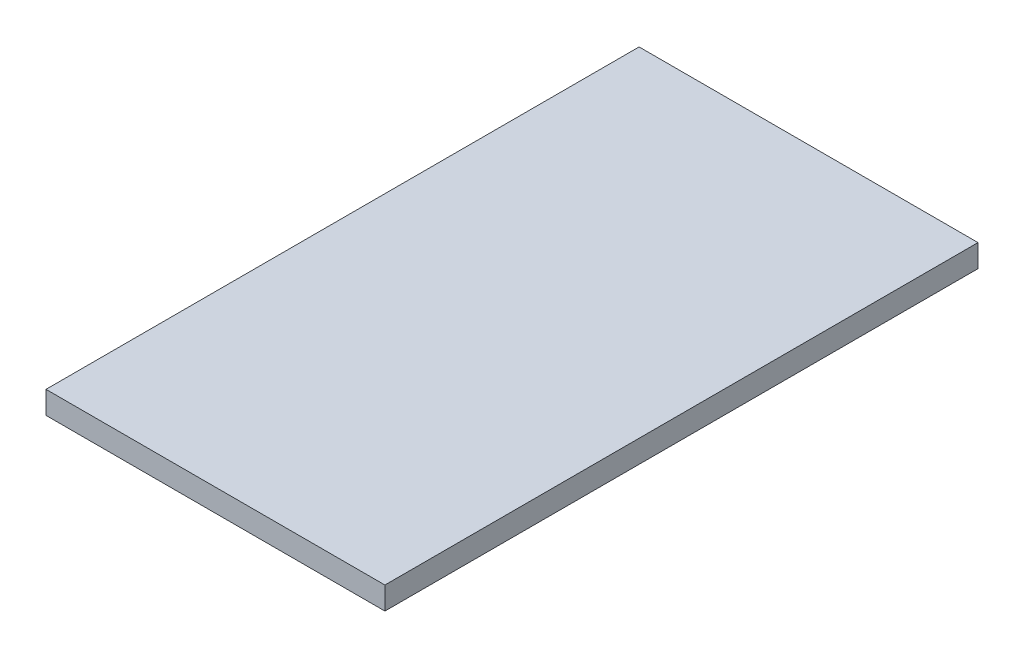
ISO-10303-21;
HEADER;
FILE_DESCRIPTION(('STEP AP214'),'2;1');
FILE_NAME('part.step','',(''),(''),'','','');
FILE_SCHEMA(('AUTOMOTIVE_DESIGN { 1 0 10303 214 1 1 1 1 }'));
ENDSEC;
DATA;
#1=APPLICATION_CONTEXT('core data for automotive mechanical design processes');
#2=APPLICATION_PROTOCOL_DEFINITION('international standard','automotive_design',2000,#1);
#3=PRODUCT_CONTEXT('',#1,'mechanical');
#4=PRODUCT('Part','Part','',(#3));
#5=PRODUCT_RELATED_PRODUCT_CATEGORY('part','',(#4));
#6=PRODUCT_DEFINITION_FORMATION('','',#4);
#7=PRODUCT_DEFINITION_CONTEXT('part definition',#1,'design');
#8=PRODUCT_DEFINITION('design','',#6,#7);
#9=PRODUCT_DEFINITION_SHAPE('','',#8);
#10=(LENGTH_UNIT() NAMED_UNIT(*) SI_UNIT(.MILLI.,.METRE.));
#11=(NAMED_UNIT(*) PLANE_ANGLE_UNIT() SI_UNIT($,.RADIAN.));
#12=(NAMED_UNIT(*) SI_UNIT($,.STERADIAN.) SOLID_ANGLE_UNIT());
#13=UNCERTAINTY_MEASURE_WITH_UNIT(LENGTH_MEASURE(1.E-05),#10,'distance_accuracy_value','');
#14=(GEOMETRIC_REPRESENTATION_CONTEXT(3) GLOBAL_UNCERTAINTY_ASSIGNED_CONTEXT((#13)) GLOBAL_UNIT_ASSIGNED_CONTEXT((#10,
#11,#12)) REPRESENTATION_CONTEXT('',''));
#15=CARTESIAN_POINT('',(0.,0.,0.));
#16=DIRECTION('',(0.,0.,1.));
#17=DIRECTION('',(1.,0.,0.));
#18=AXIS2_PLACEMENT_3D('',#15,#16,#17);
#19=CARTESIAN_POINT('',(0.,1.6,0.));
#20=DIRECTION('',(1.,0.,0.));
#21=DIRECTION('',(0.,0.,-1.));
#22=AXIS2_PLACEMENT_3D('',#19,#20,#21);
#23=PLANE('',#22);
#24=DIRECTION('',(0.,0.,1.));
#25=VECTOR('',#24,1.);
#26=CARTESIAN_POINT('',(0.,0.,0.));
#27=LINE('',#26,#25);
#28=CARTESIAN_POINT('',(0.,0.,-42.));
#29=VERTEX_POINT('',#28);
#30=CARTESIAN_POINT('',(0.,0.,0.));
#31=VERTEX_POINT('',#30);
#32=EDGE_CURVE('E96',#29,#31,#27,.T.);
#33=ORIENTED_EDGE('',*,*,#32,.T.);
#34=DIRECTION('',(0.,-1.,0.));
#35=VECTOR('',#34,1.);
#36=CARTESIAN_POINT('',(0.,1.6,0.));
#37=LINE('',#36,#35);
#38=CARTESIAN_POINT('',(0.,1.6,0.));
#39=VERTEX_POINT('',#38);
#40=EDGE_CURVE('E11',#39,#31,#37,.T.);
#41=ORIENTED_EDGE('',*,*,#40,.F.);
#42=DIRECTION('',(0.,0.,1.));
#43=VECTOR('',#42,1.);
#44=CARTESIAN_POINT('',(0.,1.6,0.));
#45=LINE('',#44,#43);
#46=CARTESIAN_POINT('',(0.,1.6,-42.));
#47=VERTEX_POINT('',#46);
#48=EDGE_CURVE('E84',#47,#39,#45,.T.);
#49=ORIENTED_EDGE('',*,*,#48,.F.);
#50=DIRECTION('',(0.,-1.,0.));
#51=VECTOR('',#50,1.);
#52=CARTESIAN_POINT('',(0.,1.6,-42.));
#53=LINE('',#52,#51);
#54=EDGE_CURVE('E92',#47,#29,#53,.T.);
#55=ORIENTED_EDGE('',*,*,#54,.T.);
#56=EDGE_LOOP('',(#33,#41,#49,#55));
#57=FACE_BOUND('',#56,.T.);
#58=ADVANCED_FACE('F33',(#57),#23,.F.);
#59=CARTESIAN_POINT('',(0.,1.6,0.));
#60=DIRECTION('',(0.,0.,-1.));
#61=DIRECTION('',(-1.,0.,0.));
#62=AXIS2_PLACEMENT_3D('',#59,#60,#61);
#63=PLANE('',#62);
#64=DIRECTION('',(1.,0.,0.));
#65=VECTOR('',#64,1.);
#66=CARTESIAN_POINT('',(0.,0.,0.));
#67=LINE('',#66,#65);
#68=CARTESIAN_POINT('',(24.,0.,0.));
#69=VERTEX_POINT('',#68);
#70=EDGE_CURVE('E88',#31,#69,#67,.T.);
#71=ORIENTED_EDGE('',*,*,#70,.T.);
#72=DIRECTION('',(0.,-1.,0.));
#73=VECTOR('',#72,1.);
#74=CARTESIAN_POINT('',(24.,1.6,0.));
#75=LINE('',#74,#73);
#76=CARTESIAN_POINT('',(24.,1.6,0.));
#77=VERTEX_POINT('',#76);
#78=EDGE_CURVE('E41',#77,#69,#75,.T.);
#79=ORIENTED_EDGE('',*,*,#78,.F.);
#80=DIRECTION('',(1.,0.,0.));
#81=VECTOR('',#80,1.);
#82=CARTESIAN_POINT('',(0.,1.6,0.));
#83=LINE('',#82,#81);
#84=EDGE_CURVE('E79',#39,#77,#83,.T.);
#85=ORIENTED_EDGE('',*,*,#84,.F.);
#86=ORIENTED_EDGE('',*,*,#40,.T.);
#87=EDGE_LOOP('',(#71,#79,#85,#86));
#88=FACE_BOUND('',#87,.T.);
#89=ADVANCED_FACE('F87',(#88),#63,.F.);
#90=CARTESIAN_POINT('',(24.,1.6,0.));
#91=DIRECTION('',(-1.,0.,0.));
#92=DIRECTION('',(0.,0.,1.));
#93=AXIS2_PLACEMENT_3D('',#90,#91,#92);
#94=PLANE('',#93);
#95=DIRECTION('',(0.,0.,-1.));
#96=VECTOR('',#95,1.);
#97=CARTESIAN_POINT('',(24.,0.,0.));
#98=LINE('',#97,#96);
#99=CARTESIAN_POINT('',(24.,0.,-42.));
#100=VERTEX_POINT('',#99);
#101=EDGE_CURVE('E66',#69,#100,#98,.T.);
#102=ORIENTED_EDGE('',*,*,#101,.T.);
#103=DIRECTION('',(0.,-1.,0.));
#104=VECTOR('',#103,1.);
#105=CARTESIAN_POINT('',(24.,1.6,-42.));
#106=LINE('',#105,#104);
#107=CARTESIAN_POINT('',(24.,1.6,-42.));
#108=VERTEX_POINT('',#107);
#109=EDGE_CURVE('E89',#108,#100,#106,.T.);
#110=ORIENTED_EDGE('',*,*,#109,.F.);
#111=DIRECTION('',(0.,0.,-1.));
#112=VECTOR('',#111,1.);
#113=CARTESIAN_POINT('',(24.,1.6,0.));
#114=LINE('',#113,#112);
#115=EDGE_CURVE('E82',#77,#108,#114,.T.);
#116=ORIENTED_EDGE('',*,*,#115,.F.);
#117=ORIENTED_EDGE('',*,*,#78,.T.);
#118=EDGE_LOOP('',(#102,#110,#116,#117));
#119=FACE_BOUND('',#118,.T.);
#120=ADVANCED_FACE('F90',(#119),#94,.F.);
#121=CARTESIAN_POINT('',(0.,1.6,-42.));
#122=DIRECTION('',(0.,0.,1.));
#123=DIRECTION('',(1.,0.,0.));
#124=AXIS2_PLACEMENT_3D('',#121,#122,#123);
#125=PLANE('',#124);
#126=DIRECTION('',(-1.,0.,0.));
#127=VECTOR('',#126,1.);
#128=CARTESIAN_POINT('',(0.,0.,-42.));
#129=LINE('',#128,#127);
#130=EDGE_CURVE('E72',#100,#29,#129,.T.);
#131=ORIENTED_EDGE('',*,*,#130,.T.);
#132=ORIENTED_EDGE('',*,*,#54,.F.);
#133=DIRECTION('',(-1.,0.,0.));
#134=VECTOR('',#133,1.);
#135=CARTESIAN_POINT('',(0.,1.6,-42.));
#136=LINE('',#135,#134);
#137=EDGE_CURVE('E49',#108,#47,#136,.T.);
#138=ORIENTED_EDGE('',*,*,#137,.F.);
#139=ORIENTED_EDGE('',*,*,#109,.T.);
#140=EDGE_LOOP('',(#131,#132,#138,#139));
#141=FACE_BOUND('',#140,.T.);
#142=ADVANCED_FACE('F103',(#141),#125,.F.);
#143=CARTESIAN_POINT('',(0.,1.6,0.));
#144=DIRECTION('',(0.,-1.,0.));
#145=DIRECTION('',(0.,0.,-1.));
#146=AXIS2_PLACEMENT_3D('',#143,#144,#145);
#147=PLANE('',#146);
#148=ORIENTED_EDGE('',*,*,#48,.T.);
#149=ORIENTED_EDGE('',*,*,#84,.T.);
#150=ORIENTED_EDGE('',*,*,#115,.T.);
#151=ORIENTED_EDGE('',*,*,#137,.T.);
#152=EDGE_LOOP('',(#148,#149,#150,#151));
#153=FACE_BOUND('',#152,.T.);
#154=ADVANCED_FACE('F80',(#153),#147,.F.);
#155=CARTESIAN_POINT('',(0.,0.,0.));
#156=DIRECTION('',(0.,-1.,0.));
#157=DIRECTION('',(0.,0.,-1.));
#158=AXIS2_PLACEMENT_3D('',#155,#156,#157);
#159=PLANE('',#158);
#160=ORIENTED_EDGE('',*,*,#32,.F.);
#161=ORIENTED_EDGE('',*,*,#130,.F.);
#162=ORIENTED_EDGE('',*,*,#101,.F.);
#163=ORIENTED_EDGE('',*,*,#70,.F.);
#164=EDGE_LOOP('',(#160,#161,#162,#163));
#165=FACE_BOUND('',#164,.T.);
#166=ADVANCED_FACE('F106',(#165),#159,.T.);
#167=CLOSED_SHELL('',(#58,#89,#120,#142,#154,#166));
#168=MANIFOLD_SOLID_BREP('B2',#167);
#169=ADVANCED_BREP_SHAPE_REPRESENTATION('',(#18,#168),#14);
#170=SHAPE_DEFINITION_REPRESENTATION(#9,#169);
ENDSEC;
END-ISO-10303-21;
